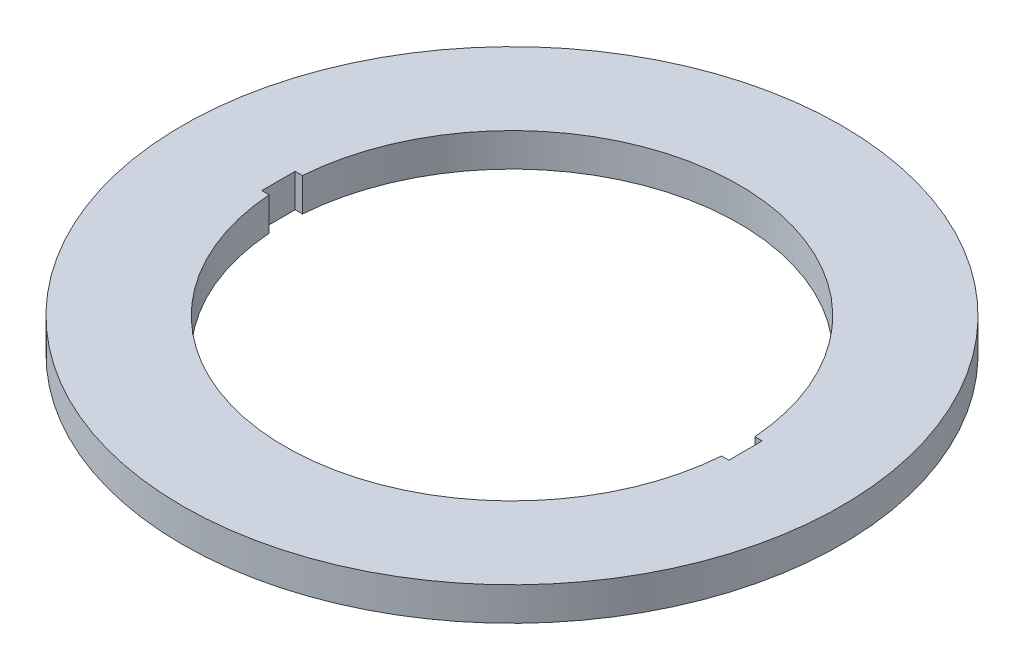
ISO-10303-21;
HEADER;
FILE_DESCRIPTION(('STEP AP214'),'2;1');
FILE_NAME('part.step','',(''),(''),'','','');
FILE_SCHEMA(('AUTOMOTIVE_DESIGN { 1 0 10303 214 1 1 1 1 }'));
ENDSEC;
DATA;
#1=APPLICATION_CONTEXT('core data for automotive mechanical design processes');
#2=APPLICATION_PROTOCOL_DEFINITION('international standard','automotive_design',2000,#1);
#3=PRODUCT_CONTEXT('',#1,'mechanical');
#4=PRODUCT('Part','Part','',(#3));
#5=PRODUCT_RELATED_PRODUCT_CATEGORY('part','',(#4));
#6=PRODUCT_DEFINITION_FORMATION('','',#4);
#7=PRODUCT_DEFINITION_CONTEXT('part definition',#1,'design');
#8=PRODUCT_DEFINITION('design','',#6,#7);
#9=PRODUCT_DEFINITION_SHAPE('','',#8);
#10=(LENGTH_UNIT() NAMED_UNIT(*) SI_UNIT(.MILLI.,.METRE.));
#11=(NAMED_UNIT(*) PLANE_ANGLE_UNIT() SI_UNIT($,.RADIAN.));
#12=(NAMED_UNIT(*) SI_UNIT($,.STERADIAN.) SOLID_ANGLE_UNIT());
#13=UNCERTAINTY_MEASURE_WITH_UNIT(LENGTH_MEASURE(1.E-05),#10,'distance_accuracy_value','');
#14=(GEOMETRIC_REPRESENTATION_CONTEXT(3) GLOBAL_UNCERTAINTY_ASSIGNED_CONTEXT((#13)) GLOBAL_UNIT_ASSIGNED_CONTEXT((#10,
#11,#12)) REPRESENTATION_CONTEXT('',''));
#15=CARTESIAN_POINT('',(0.,0.,0.));
#16=DIRECTION('',(0.,0.,1.));
#17=DIRECTION('',(1.,0.,0.));
#18=AXIS2_PLACEMENT_3D('',#15,#16,#17);
#19=CARTESIAN_POINT('',(0.,3.175,0.));
#20=DIRECTION('',(0.,1.,0.));
#21=DIRECTION('',(0.,0.,1.));
#22=AXIS2_PLACEMENT_3D('',#19,#20,#21);
#23=PLANE('',#22);
#24=CARTESIAN_POINT('',(0.,3.175,0.));
#25=DIRECTION('',(0.,1.,0.));
#26=DIRECTION('',(0.,0.,1.));
#27=AXIS2_PLACEMENT_3D('',#24,#25,#26);
#28=CIRCLE('',#27,31.369);
#29=CARTESIAN_POINT('',(0.,3.175,31.369));
#30=VERTEX_POINT('',#29);
#31=EDGE_CURVE('E11',#30,#30,#28,.T.);
#32=ORIENTED_EDGE('',*,*,#31,.T.);
#33=EDGE_LOOP('',(#32));
#34=FACE_BOUND('',#33,.T.);
#35=DIRECTION('',(1.,0.,0.));
#36=VECTOR('',#35,1.);
#37=CARTESIAN_POINT('',(21.5315569281462,3.175,1.58749999999999));
#38=LINE('',#37,#36);
#39=CARTESIAN_POINT('',(21.5315569281462,3.175,1.58749999999999));
#40=VERTEX_POINT('',#39);
#41=CARTESIAN_POINT('',(22.225,3.175,1.58749999999999));
#42=VERTEX_POINT('',#41);
#43=EDGE_CURVE('E106',#40,#42,#38,.T.);
#44=ORIENTED_EDGE('',*,*,#43,.F.);
#45=CARTESIAN_POINT('',(0.,3.175,0.));
#46=DIRECTION('',(0.,1.,0.));
#47=DIRECTION('',(0.,0.,1.));
#48=AXIS2_PLACEMENT_3D('',#45,#46,#47);
#49=CIRCLE('',#48,21.59);
#50=CARTESIAN_POINT('',(-21.5315569281462,3.175,1.5875));
#51=VERTEX_POINT('',#50);
#52=EDGE_CURVE('E98',#51,#40,#49,.T.);
#53=ORIENTED_EDGE('',*,*,#52,.F.);
#54=DIRECTION('',(1.,0.,0.));
#55=VECTOR('',#54,1.);
#56=CARTESIAN_POINT('',(-22.225,3.175,1.5875));
#57=LINE('',#56,#55);
#58=CARTESIAN_POINT('',(-22.225,3.175,1.5875));
#59=VERTEX_POINT('',#58);
#60=EDGE_CURVE('E130',#59,#51,#57,.T.);
#61=ORIENTED_EDGE('',*,*,#60,.F.);
#62=DIRECTION('',(0.,0.,1.));
#63=VECTOR('',#62,1.);
#64=CARTESIAN_POINT('',(-22.225,3.175,-1.5875));
#65=LINE('',#64,#63);
#66=CARTESIAN_POINT('',(-22.225,3.175,-1.5875));
#67=VERTEX_POINT('',#66);
#68=EDGE_CURVE('E128',#67,#59,#65,.T.);
#69=ORIENTED_EDGE('',*,*,#68,.F.);
#70=DIRECTION('',(-1.,0.,0.));
#71=VECTOR('',#70,1.);
#72=CARTESIAN_POINT('',(-22.225,3.175,-1.5875));
#73=LINE('',#72,#71);
#74=CARTESIAN_POINT('',(-21.5315569281462,3.175,-1.5875));
#75=VERTEX_POINT('',#74);
#76=EDGE_CURVE('E126',#75,#67,#73,.T.);
#77=ORIENTED_EDGE('',*,*,#76,.F.);
#78=CARTESIAN_POINT('',(0.,3.175,0.));
#79=DIRECTION('',(0.,1.,0.));
#80=DIRECTION('',(0.,0.,1.));
#81=AXIS2_PLACEMENT_3D('',#78,#79,#80);
#82=CIRCLE('',#81,21.59);
#83=CARTESIAN_POINT('',(21.5315569281462,3.175,-1.58750000000001));
#84=VERTEX_POINT('',#83);
#85=EDGE_CURVE('E124',#84,#75,#82,.T.);
#86=ORIENTED_EDGE('',*,*,#85,.F.);
#87=DIRECTION('',(-1.,0.,0.));
#88=VECTOR('',#87,1.);
#89=CARTESIAN_POINT('',(21.5315569281462,3.175,-1.58750000000001));
#90=LINE('',#89,#88);
#91=CARTESIAN_POINT('',(22.225,3.175,-1.58750000000001));
#92=VERTEX_POINT('',#91);
#93=EDGE_CURVE('E120',#92,#84,#90,.T.);
#94=ORIENTED_EDGE('',*,*,#93,.F.);
#95=DIRECTION('',(0.,0.,-1.));
#96=VECTOR('',#95,1.);
#97=CARTESIAN_POINT('',(22.225,3.175,-1.58750000000001));
#98=LINE('',#97,#96);
#99=EDGE_CURVE('E118',#42,#92,#98,.T.);
#100=ORIENTED_EDGE('',*,*,#99,.F.);
#101=EDGE_LOOP('',(#44,#53,#61,#69,#77,#86,#94,#100));
#102=FACE_BOUND('',#101,.T.);
#103=ADVANCED_FACE('F33',(#34,#102),#23,.T.);
#104=CARTESIAN_POINT('',(0.,0.,0.));
#105=DIRECTION('',(0.,1.,0.));
#106=DIRECTION('',(0.,0.,1.));
#107=AXIS2_PLACEMENT_3D('',#104,#105,#106);
#108=PLANE('',#107);
#109=CARTESIAN_POINT('',(0.,0.,0.));
#110=DIRECTION('',(0.,1.,0.));
#111=DIRECTION('',(0.,0.,1.));
#112=AXIS2_PLACEMENT_3D('',#109,#110,#111);
#113=CIRCLE('',#112,31.369);
#114=CARTESIAN_POINT('',(0.,0.,31.369));
#115=VERTEX_POINT('',#114);
#116=EDGE_CURVE('E37',#115,#115,#113,.T.);
#117=ORIENTED_EDGE('',*,*,#116,.F.);
#118=EDGE_LOOP('',(#117));
#119=FACE_BOUND('',#118,.T.);
#120=CARTESIAN_POINT('',(0.,0.,0.));
#121=DIRECTION('',(0.,1.,0.));
#122=DIRECTION('',(0.,0.,1.));
#123=AXIS2_PLACEMENT_3D('',#120,#121,#122);
#124=CIRCLE('',#123,21.59);
#125=CARTESIAN_POINT('',(-21.5315569281462,0.,1.5875));
#126=VERTEX_POINT('',#125);
#127=CARTESIAN_POINT('',(21.5315569281462,0.,1.58749999999999));
#128=VERTEX_POINT('',#127);
#129=EDGE_CURVE('E56',#126,#128,#124,.T.);
#130=ORIENTED_EDGE('',*,*,#129,.T.);
#131=DIRECTION('',(1.,0.,0.));
#132=VECTOR('',#131,1.);
#133=CARTESIAN_POINT('',(21.5315569281462,0.,1.58749999999999));
#134=LINE('',#133,#132);
#135=CARTESIAN_POINT('',(22.225,0.,1.58749999999999));
#136=VERTEX_POINT('',#135);
#137=EDGE_CURVE('E113',#128,#136,#134,.T.);
#138=ORIENTED_EDGE('',*,*,#137,.T.);
#139=DIRECTION('',(0.,0.,-1.));
#140=VECTOR('',#139,1.);
#141=CARTESIAN_POINT('',(22.225,0.,-1.58750000000001));
#142=LINE('',#141,#140);
#143=CARTESIAN_POINT('',(22.225,0.,-1.58750000000001));
#144=VERTEX_POINT('',#143);
#145=EDGE_CURVE('E134',#136,#144,#142,.T.);
#146=ORIENTED_EDGE('',*,*,#145,.T.);
#147=DIRECTION('',(-1.,0.,0.));
#148=VECTOR('',#147,1.);
#149=CARTESIAN_POINT('',(21.5315569281462,0.,-1.58750000000001));
#150=LINE('',#149,#148);
#151=CARTESIAN_POINT('',(21.5315569281462,0.,-1.58750000000001));
#152=VERTEX_POINT('',#151);
#153=EDGE_CURVE('E137',#144,#152,#150,.T.);
#154=ORIENTED_EDGE('',*,*,#153,.T.);
#155=CARTESIAN_POINT('',(0.,0.,0.));
#156=DIRECTION('',(0.,1.,0.));
#157=DIRECTION('',(0.,0.,1.));
#158=AXIS2_PLACEMENT_3D('',#155,#156,#157);
#159=CIRCLE('',#158,21.59);
#160=CARTESIAN_POINT('',(-21.5315569281462,0.,-1.5875));
#161=VERTEX_POINT('',#160);
#162=EDGE_CURVE('E140',#152,#161,#159,.T.);
#163=ORIENTED_EDGE('',*,*,#162,.T.);
#164=DIRECTION('',(-1.,0.,0.));
#165=VECTOR('',#164,1.);
#166=CARTESIAN_POINT('',(-22.225,0.,-1.5875));
#167=LINE('',#166,#165);
#168=CARTESIAN_POINT('',(-22.225,0.,-1.5875));
#169=VERTEX_POINT('',#168);
#170=EDGE_CURVE('E143',#161,#169,#167,.T.);
#171=ORIENTED_EDGE('',*,*,#170,.T.);
#172=DIRECTION('',(0.,0.,1.));
#173=VECTOR('',#172,1.);
#174=CARTESIAN_POINT('',(-22.225,0.,-1.5875));
#175=LINE('',#174,#173);
#176=CARTESIAN_POINT('',(-22.225,0.,1.5875));
#177=VERTEX_POINT('',#176);
#178=EDGE_CURVE('E146',#169,#177,#175,.T.);
#179=ORIENTED_EDGE('',*,*,#178,.T.);
#180=DIRECTION('',(1.,0.,0.));
#181=VECTOR('',#180,1.);
#182=CARTESIAN_POINT('',(-22.225,0.,1.5875));
#183=LINE('',#182,#181);
#184=EDGE_CURVE('E107',#177,#126,#183,.T.);
#185=ORIENTED_EDGE('',*,*,#184,.T.);
#186=EDGE_LOOP('',(#130,#138,#146,#154,#163,#171,#179,#185));
#187=FACE_BOUND('',#186,.T.);
#188=ADVANCED_FACE('F167',(#119,#187),#108,.F.);
#189=CARTESIAN_POINT('',(0.,3.175,0.));
#190=DIRECTION('',(0.,-1.,0.));
#191=DIRECTION('',(0.,0.,-1.));
#192=AXIS2_PLACEMENT_3D('',#189,#190,#191);
#193=CYLINDRICAL_SURFACE('',#192,31.369);
#194=ORIENTED_EDGE('',*,*,#31,.F.);
#195=EDGE_LOOP('',(#194));
#196=FACE_BOUND('',#195,.T.);
#197=ORIENTED_EDGE('',*,*,#116,.T.);
#198=EDGE_LOOP('',(#197));
#199=FACE_BOUND('',#198,.T.);
#200=ADVANCED_FACE('F35',(#196,#199),#193,.T.);
#201=CARTESIAN_POINT('',(0.,3.175,0.));
#202=DIRECTION('',(0.,-1.,0.));
#203=DIRECTION('',(0.,0.,-1.));
#204=AXIS2_PLACEMENT_3D('',#201,#202,#203);
#205=CYLINDRICAL_SURFACE('',#204,21.59);
#206=ORIENTED_EDGE('',*,*,#129,.F.);
#207=DIRECTION('',(0.,-1.,0.));
#208=VECTOR('',#207,1.);
#209=CARTESIAN_POINT('',(-21.5315569281462,3.175,1.5875));
#210=LINE('',#209,#208);
#211=EDGE_CURVE('E102',#51,#126,#210,.T.);
#212=ORIENTED_EDGE('',*,*,#211,.F.);
#213=ORIENTED_EDGE('',*,*,#52,.T.);
#214=DIRECTION('',(0.,-1.,0.));
#215=VECTOR('',#214,1.);
#216=CARTESIAN_POINT('',(21.5315569281462,3.175,1.58749999999999));
#217=LINE('',#216,#215);
#218=EDGE_CURVE('E101',#40,#128,#217,.T.);
#219=ORIENTED_EDGE('',*,*,#218,.T.);
#220=EDGE_LOOP('',(#206,#212,#213,#219));
#221=FACE_BOUND('',#220,.T.);
#222=ADVANCED_FACE('F100',(#221),#205,.F.);
#223=CARTESIAN_POINT('',(21.5315569281462,3.175,1.58749999999999));
#224=DIRECTION('',(0.,0.,-1.));
#225=DIRECTION('',(-1.,0.,0.));
#226=AXIS2_PLACEMENT_3D('',#223,#224,#225);
#227=PLANE('',#226);
#228=ORIENTED_EDGE('',*,*,#137,.F.);
#229=ORIENTED_EDGE('',*,*,#218,.F.);
#230=ORIENTED_EDGE('',*,*,#43,.T.);
#231=DIRECTION('',(0.,-1.,0.));
#232=VECTOR('',#231,1.);
#233=CARTESIAN_POINT('',(22.225,3.175,1.58749999999999));
#234=LINE('',#233,#232);
#235=EDGE_CURVE('E114',#42,#136,#234,.T.);
#236=ORIENTED_EDGE('',*,*,#235,.T.);
#237=EDGE_LOOP('',(#228,#229,#230,#236));
#238=FACE_BOUND('',#237,.T.);
#239=ADVANCED_FACE('F110',(#238),#227,.T.);
#240=CARTESIAN_POINT('',(22.225,3.175,-1.58750000000001));
#241=DIRECTION('',(-1.,0.,0.));
#242=DIRECTION('',(0.,0.,1.));
#243=AXIS2_PLACEMENT_3D('',#240,#241,#242);
#244=PLANE('',#243);
#245=ORIENTED_EDGE('',*,*,#145,.F.);
#246=ORIENTED_EDGE('',*,*,#235,.F.);
#247=ORIENTED_EDGE('',*,*,#99,.T.);
#248=DIRECTION('',(0.,-1.,0.));
#249=VECTOR('',#248,1.);
#250=CARTESIAN_POINT('',(22.225,3.175,-1.58750000000001));
#251=LINE('',#250,#249);
#252=EDGE_CURVE('E159',#92,#144,#251,.T.);
#253=ORIENTED_EDGE('',*,*,#252,.T.);
#254=EDGE_LOOP('',(#245,#246,#247,#253));
#255=FACE_BOUND('',#254,.T.);
#256=ADVANCED_FACE('F163',(#255),#244,.T.);
#257=CARTESIAN_POINT('',(21.5315569281462,3.175,-1.58750000000001));
#258=DIRECTION('',(0.,0.,1.));
#259=DIRECTION('',(1.,0.,0.));
#260=AXIS2_PLACEMENT_3D('',#257,#258,#259);
#261=PLANE('',#260);
#262=ORIENTED_EDGE('',*,*,#153,.F.);
#263=ORIENTED_EDGE('',*,*,#252,.F.);
#264=ORIENTED_EDGE('',*,*,#93,.T.);
#265=DIRECTION('',(0.,-1.,0.));
#266=VECTOR('',#265,1.);
#267=CARTESIAN_POINT('',(21.5315569281462,3.175,-1.58750000000001));
#268=LINE('',#267,#266);
#269=EDGE_CURVE('E157',#84,#152,#268,.T.);
#270=ORIENTED_EDGE('',*,*,#269,.T.);
#271=EDGE_LOOP('',(#262,#263,#264,#270));
#272=FACE_BOUND('',#271,.T.);
#273=ADVANCED_FACE('F185',(#272),#261,.T.);
#274=CARTESIAN_POINT('',(0.,3.175,0.));
#275=DIRECTION('',(0.,-1.,0.));
#276=DIRECTION('',(0.,0.,-1.));
#277=AXIS2_PLACEMENT_3D('',#274,#275,#276);
#278=CYLINDRICAL_SURFACE('',#277,21.59);
#279=ORIENTED_EDGE('',*,*,#162,.F.);
#280=ORIENTED_EDGE('',*,*,#269,.F.);
#281=ORIENTED_EDGE('',*,*,#85,.T.);
#282=DIRECTION('',(0.,-1.,0.));
#283=VECTOR('',#282,1.);
#284=CARTESIAN_POINT('',(-21.5315569281462,3.175,-1.5875));
#285=LINE('',#284,#283);
#286=EDGE_CURVE('E155',#75,#161,#285,.T.);
#287=ORIENTED_EDGE('',*,*,#286,.T.);
#288=EDGE_LOOP('',(#279,#280,#281,#287));
#289=FACE_BOUND('',#288,.T.);
#290=ADVANCED_FACE('F182',(#289),#278,.F.);
#291=CARTESIAN_POINT('',(-22.225,3.175,-1.5875));
#292=DIRECTION('',(0.,0.,1.));
#293=DIRECTION('',(1.,0.,0.));
#294=AXIS2_PLACEMENT_3D('',#291,#292,#293);
#295=PLANE('',#294);
#296=ORIENTED_EDGE('',*,*,#170,.F.);
#297=ORIENTED_EDGE('',*,*,#286,.F.);
#298=ORIENTED_EDGE('',*,*,#76,.T.);
#299=DIRECTION('',(0.,-1.,0.));
#300=VECTOR('',#299,1.);
#301=CARTESIAN_POINT('',(-22.225,3.175,-1.5875));
#302=LINE('',#301,#300);
#303=EDGE_CURVE('E153',#67,#169,#302,.T.);
#304=ORIENTED_EDGE('',*,*,#303,.T.);
#305=EDGE_LOOP('',(#296,#297,#298,#304));
#306=FACE_BOUND('',#305,.T.);
#307=ADVANCED_FACE('F178',(#306),#295,.T.);
#308=CARTESIAN_POINT('',(-22.225,3.175,-1.5875));
#309=DIRECTION('',(1.,0.,0.));
#310=DIRECTION('',(0.,0.,-1.));
#311=AXIS2_PLACEMENT_3D('',#308,#309,#310);
#312=PLANE('',#311);
#313=ORIENTED_EDGE('',*,*,#178,.F.);
#314=ORIENTED_EDGE('',*,*,#303,.F.);
#315=ORIENTED_EDGE('',*,*,#68,.T.);
#316=DIRECTION('',(0.,-1.,0.));
#317=VECTOR('',#316,1.);
#318=CARTESIAN_POINT('',(-22.225,3.175,1.5875));
#319=LINE('',#318,#317);
#320=EDGE_CURVE('E48',#59,#177,#319,.T.);
#321=ORIENTED_EDGE('',*,*,#320,.T.);
#322=EDGE_LOOP('',(#313,#314,#315,#321));
#323=FACE_BOUND('',#322,.T.);
#324=ADVANCED_FACE('F175',(#323),#312,.T.);
#325=CARTESIAN_POINT('',(-22.225,3.175,1.5875));
#326=DIRECTION('',(0.,0.,-1.));
#327=DIRECTION('',(-1.,0.,0.));
#328=AXIS2_PLACEMENT_3D('',#325,#326,#327);
#329=PLANE('',#328);
#330=ORIENTED_EDGE('',*,*,#184,.F.);
#331=ORIENTED_EDGE('',*,*,#320,.F.);
#332=ORIENTED_EDGE('',*,*,#60,.T.);
#333=ORIENTED_EDGE('',*,*,#211,.T.);
#334=EDGE_LOOP('',(#330,#331,#332,#333));
#335=FACE_BOUND('',#334,.T.);
#336=ADVANCED_FACE('F169',(#335),#329,.T.);
#337=CLOSED_SHELL('',(#103,#188,#200,#222,#239,#256,#273,#290,#307,#324,#336));
#338=MANIFOLD_SOLID_BREP('B2',#337);
#339=ADVANCED_BREP_SHAPE_REPRESENTATION('',(#18,#338),#14);
#340=SHAPE_DEFINITION_REPRESENTATION(#9,#339);
ENDSEC;
END-ISO-10303-21;
